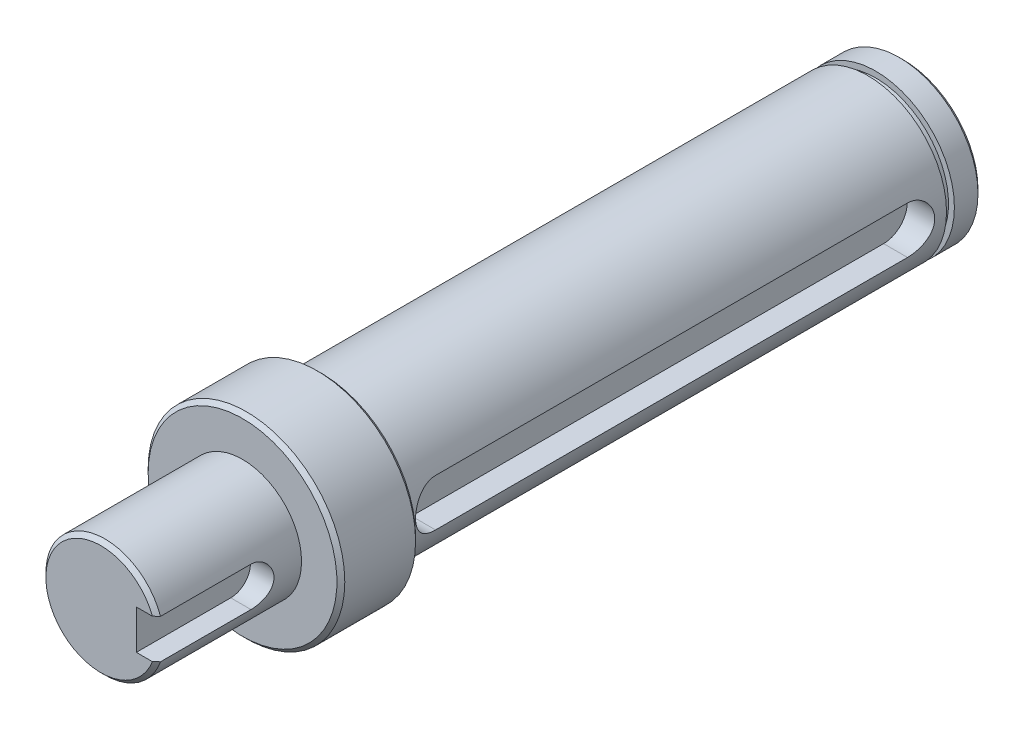
ISO-10303-21;
HEADER;
FILE_DESCRIPTION(('STEP AP214'),'2;1');
FILE_NAME('part.step','',(''),(''),'','','');
FILE_SCHEMA(('AUTOMOTIVE_DESIGN { 1 0 10303 214 1 1 1 1 }'));
ENDSEC;
DATA;
#1=APPLICATION_CONTEXT('core data for automotive mechanical design processes');
#2=APPLICATION_PROTOCOL_DEFINITION('international standard','automotive_design',2000,#1);
#3=PRODUCT_CONTEXT('',#1,'mechanical');
#4=PRODUCT('Part','Part','',(#3));
#5=PRODUCT_RELATED_PRODUCT_CATEGORY('part','',(#4));
#6=PRODUCT_DEFINITION_FORMATION('','',#4);
#7=PRODUCT_DEFINITION_CONTEXT('part definition',#1,'design');
#8=PRODUCT_DEFINITION('design','',#6,#7);
#9=PRODUCT_DEFINITION_SHAPE('','',#8);
#10=(LENGTH_UNIT() NAMED_UNIT(*) SI_UNIT(.MILLI.,.METRE.));
#11=(NAMED_UNIT(*) PLANE_ANGLE_UNIT() SI_UNIT($,.RADIAN.));
#12=(NAMED_UNIT(*) SI_UNIT($,.STERADIAN.) SOLID_ANGLE_UNIT());
#13=UNCERTAINTY_MEASURE_WITH_UNIT(LENGTH_MEASURE(1.E-05),#10,'distance_accuracy_value','');
#14=(GEOMETRIC_REPRESENTATION_CONTEXT(3) GLOBAL_UNCERTAINTY_ASSIGNED_CONTEXT((#13)) GLOBAL_UNIT_ASSIGNED_CONTEXT((#10,
#11,#12)) REPRESENTATION_CONTEXT('',''));
#15=CARTESIAN_POINT('',(0.,0.,0.));
#16=DIRECTION('',(0.,0.,1.));
#17=DIRECTION('',(1.,0.,0.));
#18=AXIS2_PLACEMENT_3D('',#15,#16,#17);
#19=CARTESIAN_POINT('',(0.,0.,102.));
#20=DIRECTION('',(0.,0.,1.));
#21=DIRECTION('',(1.,0.,0.));
#22=AXIS2_PLACEMENT_3D('',#19,#20,#21);
#23=PLANE('',#22);
#24=DIRECTION('',(-1.,0.,0.));
#25=VECTOR('',#24,1.);
#26=CARTESIAN_POINT('',(4.5,-2.5,102.000000000005));
#27=LINE('',#26,#25);
#28=CARTESIAN_POINT('',(6.53834841531369,-2.5,102.000000000005));
#29=VERTEX_POINT('',#28);
#30=CARTESIAN_POINT('',(4.5,-2.5,102.000000000003));
#31=VERTEX_POINT('',#30);
#32=EDGE_CURVE('E33',#29,#31,#27,.T.);
#33=ORIENTED_EDGE('',*,*,#32,.T.);
#34=DIRECTION('',(0.,-1.,0.));
#35=VECTOR('',#34,1.);
#36=CARTESIAN_POINT('',(4.5,0.,102.));
#37=LINE('',#36,#35);
#38=CARTESIAN_POINT('',(4.5,2.5,102.));
#39=VERTEX_POINT('',#38);
#40=EDGE_CURVE('E11',#39,#31,#37,.T.);
#41=ORIENTED_EDGE('',*,*,#40,.F.);
#42=DIRECTION('',(1.,0.,0.));
#43=VECTOR('',#42,1.);
#44=CARTESIAN_POINT('',(4.5,2.5,102.));
#45=LINE('',#44,#43);
#46=CARTESIAN_POINT('',(6.53834841531371,2.5,102.000000000005));
#47=VERTEX_POINT('',#46);
#48=EDGE_CURVE('E204',#39,#47,#45,.T.);
#49=ORIENTED_EDGE('',*,*,#48,.T.);
#50=CARTESIAN_POINT('',(0.,0.,102.000000000009));
#51=DIRECTION('',(0.,0.,-1.));
#52=DIRECTION('',(-1.,0.,0.));
#53=AXIS2_PLACEMENT_3D('',#50,#51,#52);
#54=CIRCLE('',#53,6.99999999999794);
#55=EDGE_CURVE('E191',#29,#47,#54,.T.);
#56=ORIENTED_EDGE('',*,*,#55,.F.);
#57=EDGE_LOOP('',(#33,#41,#49,#56));
#58=FACE_BOUND('',#57,.T.);
#59=ADVANCED_FACE('F17',(#58),#23,.T.);
#60=CARTESIAN_POINT('',(4.5,0.,0.));
#61=DIRECTION('',(1.,0.,0.));
#62=DIRECTION('',(0.,1.,0.));
#63=AXIS2_PLACEMENT_3D('',#60,#61,#62);
#64=PLANE('',#63);
#65=DIRECTION('',(0.,0.,-1.));
#66=VECTOR('',#65,1.);
#67=CARTESIAN_POINT('',(4.5,-2.5,102.));
#68=LINE('',#67,#66);
#69=CARTESIAN_POINT('',(4.5,-2.5,90.));
#70=VERTEX_POINT('',#69);
#71=EDGE_CURVE('E140',#31,#70,#68,.T.);
#72=ORIENTED_EDGE('',*,*,#71,.T.);
#73=CARTESIAN_POINT('',(4.5,0.,90.));
#74=DIRECTION('',(1.,0.,0.));
#75=DIRECTION('',(0.,0.,-1.));
#76=AXIS2_PLACEMENT_3D('',#73,#74,#75);
#77=CIRCLE('',#76,2.5);
#78=CARTESIAN_POINT('',(4.5,2.5,90.));
#79=VERTEX_POINT('',#78);
#80=EDGE_CURVE('E185',#70,#79,#77,.T.);
#81=ORIENTED_EDGE('',*,*,#80,.T.);
#82=DIRECTION('',(0.,0.,1.));
#83=VECTOR('',#82,1.);
#84=CARTESIAN_POINT('',(4.5,2.5,90.));
#85=LINE('',#84,#83);
#86=EDGE_CURVE('E143',#79,#39,#85,.T.);
#87=ORIENTED_EDGE('',*,*,#86,.T.);
#88=ORIENTED_EDGE('',*,*,#40,.T.);
#89=EDGE_LOOP('',(#72,#81,#87,#88));
#90=FACE_BOUND('',#89,.T.);
#91=ADVANCED_FACE('F287',(#90),#64,.T.);
#92=CARTESIAN_POINT('',(4.5,-2.5,102.));
#93=DIRECTION('',(0.,-1.,0.));
#94=DIRECTION('',(0.,0.,-1.));
#95=AXIS2_PLACEMENT_3D('',#92,#93,#94);
#96=PLANE('',#95);
#97=ORIENTED_EDGE('',*,*,#71,.F.);
#98=ORIENTED_EDGE('',*,*,#32,.F.);
#99=CARTESIAN_POINT('',(7.07106781186693,-2.50000000000004,101.500000000003));
#100=CARTESIAN_POINT('',(6.8938690276034,-2.5,101.667064615967));
#101=CARTESIAN_POINT('',(6.7163233931204,-2.5,101.833762512275));
#102=CARTESIAN_POINT('',(6.53834841531369,-2.5,102.000000000005));
#103=B_SPLINE_CURVE_WITH_KNOTS('',3,(#99,#100,#101,#102),.UNSPECIFIED.,.F.,.F.,(4,4),(0.,
0.000730609304256414),.UNSPECIFIED.);
#104=CARTESIAN_POINT('',(7.07106781186693,-2.50000000000004,101.500000000003));
#105=VERTEX_POINT('',#104);
#106=EDGE_CURVE('E195',#105,#29,#103,.T.);
#107=ORIENTED_EDGE('',*,*,#106,.F.);
#108=DIRECTION('',(0.,0.,1.));
#109=VECTOR('',#108,1.);
#110=CARTESIAN_POINT('',(7.07106781186545,-2.50000000000008,102.));
#111=LINE('',#110,#109);
#112=CARTESIAN_POINT('',(7.07106781186546,-2.50000000000004,90.));
#113=VERTEX_POINT('',#112);
#114=EDGE_CURVE('E215',#113,#105,#111,.T.);
#115=ORIENTED_EDGE('',*,*,#114,.F.);
#116=DIRECTION('',(1.,0.,0.));
#117=VECTOR('',#116,1.);
#118=CARTESIAN_POINT('',(4.5,-2.5,90.));
#119=LINE('',#118,#117);
#120=EDGE_CURVE('E211',#70,#113,#119,.T.);
#121=ORIENTED_EDGE('',*,*,#120,.F.);
#122=EDGE_LOOP('',(#97,#98,#107,#115,#121));
#123=FACE_BOUND('',#122,.T.);
#124=ADVANCED_FACE('F292',(#123),#96,.F.);
#125=CARTESIAN_POINT('',(4.5,2.5,90.));
#126=DIRECTION('',(0.,1.,0.));
#127=DIRECTION('',(1.,0.,0.));
#128=AXIS2_PLACEMENT_3D('',#125,#126,#127);
#129=PLANE('',#128);
#130=DIRECTION('',(1.,0.,0.));
#131=VECTOR('',#130,1.);
#132=CARTESIAN_POINT('',(4.5,2.5,90.));
#133=LINE('',#132,#131);
#134=CARTESIAN_POINT('',(7.07106781186545,2.50000000000004,90.));
#135=VERTEX_POINT('',#134);
#136=EDGE_CURVE('E189',#79,#135,#133,.T.);
#137=ORIENTED_EDGE('',*,*,#136,.T.);
#138=DIRECTION('',(0.,0.,-1.));
#139=VECTOR('',#138,1.);
#140=CARTESIAN_POINT('',(7.07106781186542,2.50000000000015,102.));
#141=LINE('',#140,#139);
#142=CARTESIAN_POINT('',(7.07106781186717,2.50000000000008,101.500000000002));
#143=VERTEX_POINT('',#142);
#144=EDGE_CURVE('E184',#143,#135,#141,.T.);
#145=ORIENTED_EDGE('',*,*,#144,.F.);
#146=CARTESIAN_POINT('',(6.53834841531371,2.5,102.000000000005));
#147=CARTESIAN_POINT('',(6.71632339312194,2.5,101.833762512273));
#148=CARTESIAN_POINT('',(6.89386902760443,2.5,101.667064615966));
#149=CARTESIAN_POINT('',(7.07106781186717,2.50000000000008,101.500000000002));
#150=B_SPLINE_CURVE_WITH_KNOTS('',3,(#146,#147,#148,#149),.UNSPECIFIED.,.F.,.F.,(4,4),(0.,
0.000730609304253691),.UNSPECIFIED.);
#151=EDGE_CURVE('E208',#47,#143,#150,.T.);
#152=ORIENTED_EDGE('',*,*,#151,.F.);
#153=ORIENTED_EDGE('',*,*,#48,.F.);
#154=ORIENTED_EDGE('',*,*,#86,.F.);
#155=EDGE_LOOP('',(#137,#145,#152,#153,#154));
#156=FACE_BOUND('',#155,.T.);
#157=ADVANCED_FACE('F675',(#156),#129,.F.);
#158=CARTESIAN_POINT('',(0.,0.,0.));
#159=DIRECTION('',(0.,0.,1.));
#160=DIRECTION('',(1.,0.,0.));
#161=AXIS2_PLACEMENT_3D('',#158,#159,#160);
#162=PLANE('',#161);
#163=CARTESIAN_POINT('',(0.,0.,0.));
#164=DIRECTION('',(0.,0.,1.));
#165=DIRECTION('',(1.,0.,0.));
#166=AXIS2_PLACEMENT_3D('',#163,#164,#165);
#167=CIRCLE('',#166,9.5);
#168=CARTESIAN_POINT('',(9.5,0.,0.));
#169=VERTEX_POINT('',#168);
#170=EDGE_CURVE('E172',#169,#169,#167,.T.);
#171=ORIENTED_EDGE('',*,*,#170,.F.);
#172=EDGE_LOOP('',(#171));
#173=FACE_BOUND('',#172,.T.);
#174=ADVANCED_FACE('F664',(#173),#162,.F.);
#175=CARTESIAN_POINT('',(0.,0.,84.));
#176=DIRECTION('',(0.,0.,1.));
#177=DIRECTION('',(1.,0.,0.));
#178=AXIS2_PLACEMENT_3D('',#175,#176,#177);
#179=PLANE('',#178);
#180=CARTESIAN_POINT('',(0.,0.,84.));
#181=DIRECTION('',(0.,0.,-1.));
#182=DIRECTION('',(1.,0.,0.));
#183=AXIS2_PLACEMENT_3D('',#180,#181,#182);
#184=CIRCLE('',#183,7.5);
#185=CARTESIAN_POINT('',(7.5,0.,84.));
#186=VERTEX_POINT('',#185);
#187=EDGE_CURVE('E176',#186,#186,#184,.T.);
#188=ORIENTED_EDGE('',*,*,#187,.T.);
#189=EDGE_LOOP('',(#188));
#190=FACE_BOUND('',#189,.T.);
#191=CARTESIAN_POINT('',(0.,0.,84.));
#192=DIRECTION('',(0.,0.,-1.));
#193=DIRECTION('',(-1.,0.,0.));
#194=AXIS2_PLACEMENT_3D('',#191,#192,#193);
#195=CIRCLE('',#194,12.);
#196=CARTESIAN_POINT('',(-12.,0.,84.));
#197=VERTEX_POINT('',#196);
#198=EDGE_CURVE('E160',#197,#197,#195,.T.);
#199=ORIENTED_EDGE('',*,*,#198,.F.);
#200=EDGE_LOOP('',(#199));
#201=FACE_BOUND('',#200,.T.);
#202=ADVANCED_FACE('F653',(#190,#201),#179,.T.);
#203=CARTESIAN_POINT('',(0.,0.,3.5));
#204=DIRECTION('',(0.,0.,-1.));
#205=DIRECTION('',(0.,-1.,0.));
#206=AXIS2_PLACEMENT_3D('',#203,#204,#205);
#207=PLANE('',#206);
#208=CARTESIAN_POINT('',(0.,0.,3.5));
#209=DIRECTION('',(0.,0.,1.));
#210=DIRECTION('',(-1.,0.,0.));
#211=AXIS2_PLACEMENT_3D('',#208,#209,#210);
#212=CIRCLE('',#211,9.25);
#213=CARTESIAN_POINT('',(-9.25,0.,3.5));
#214=VERTEX_POINT('',#213);
#215=EDGE_CURVE('E152',#214,#214,#212,.T.);
#216=ORIENTED_EDGE('',*,*,#215,.F.);
#217=EDGE_LOOP('',(#216));
#218=FACE_BOUND('',#217,.T.);
#219=CARTESIAN_POINT('',(0.,0.,3.5));
#220=DIRECTION('',(0.,0.,-1.));
#221=DIRECTION('',(1.,0.,0.));
#222=AXIS2_PLACEMENT_3D('',#219,#220,#221);
#223=CIRCLE('',#222,10.);
#224=CARTESIAN_POINT('',(10.,0.,3.5));
#225=VERTEX_POINT('',#224);
#226=EDGE_CURVE('E168',#225,#225,#223,.T.);
#227=ORIENTED_EDGE('',*,*,#226,.F.);
#228=EDGE_LOOP('',(#227));
#229=FACE_BOUND('',#228,.T.);
#230=ADVANCED_FACE('F643',(#218,#229),#207,.F.);
#231=CARTESIAN_POINT('',(6.5,0.,0.));
#232=DIRECTION('',(1.,0.,0.));
#233=DIRECTION('',(0.,1.,0.));
#234=AXIS2_PLACEMENT_3D('',#231,#232,#233);
#235=PLANE('',#234);
#236=DIRECTION('',(0.,0.,-1.));
#237=VECTOR('',#236,1.);
#238=CARTESIAN_POINT('',(6.5,-3.,69.));
#239=LINE('',#238,#237);
#240=CARTESIAN_POINT('',(6.5,-3.,69.));
#241=VERTEX_POINT('',#240);
#242=CARTESIAN_POINT('',(6.5,-3.,9.));
#243=VERTEX_POINT('',#242);
#244=EDGE_CURVE('E198',#241,#243,#239,.T.);
#245=ORIENTED_EDGE('',*,*,#244,.T.);
#246=CARTESIAN_POINT('',(6.5,0.,9.));
#247=DIRECTION('',(1.,0.,0.));
#248=DIRECTION('',(0.,0.,-1.));
#249=AXIS2_PLACEMENT_3D('',#246,#247,#248);
#250=CIRCLE('',#249,3.);
#251=CARTESIAN_POINT('',(6.5,3.,9.));
#252=VERTEX_POINT('',#251);
#253=EDGE_CURVE('E136',#243,#252,#250,.T.);
#254=ORIENTED_EDGE('',*,*,#253,.T.);
#255=DIRECTION('',(0.,0.,1.));
#256=VECTOR('',#255,1.);
#257=CARTESIAN_POINT('',(6.5,3.,9.));
#258=LINE('',#257,#256);
#259=CARTESIAN_POINT('',(6.5,3.,69.));
#260=VERTEX_POINT('',#259);
#261=EDGE_CURVE('E201',#252,#260,#258,.T.);
#262=ORIENTED_EDGE('',*,*,#261,.T.);
#263=CARTESIAN_POINT('',(6.5,0.,69.));
#264=DIRECTION('',(1.,0.,0.));
#265=DIRECTION('',(0.,0.,-1.));
#266=AXIS2_PLACEMENT_3D('',#263,#264,#265);
#267=CIRCLE('',#266,3.);
#268=EDGE_CURVE('E101',#260,#241,#267,.T.);
#269=ORIENTED_EDGE('',*,*,#268,.T.);
#270=EDGE_LOOP('',(#245,#254,#262,#269));
#271=FACE_BOUND('',#270,.T.);
#272=ADVANCED_FACE('F335',(#271),#235,.T.);
#273=CARTESIAN_POINT('',(6.5,3.,9.));
#274=DIRECTION('',(0.,1.,0.));
#275=DIRECTION('',(1.,0.,0.));
#276=AXIS2_PLACEMENT_3D('',#273,#274,#275);
#277=PLANE('',#276);
#278=DIRECTION('',(1.,0.,0.));
#279=VECTOR('',#278,1.);
#280=CARTESIAN_POINT('',(6.5,3.,9.));
#281=LINE('',#280,#279);
#282=CARTESIAN_POINT('',(9.53939201416945,3.00000000000002,9.));
#283=VERTEX_POINT('',#282);
#284=EDGE_CURVE('E85',#252,#283,#281,.T.);
#285=ORIENTED_EDGE('',*,*,#284,.T.);
#286=DIRECTION('',(0.,0.,-1.));
#287=VECTOR('',#286,1.);
#288=CARTESIAN_POINT('',(9.53939201416944,3.00000000000007,0.));
#289=LINE('',#288,#287);
#290=CARTESIAN_POINT('',(9.53939201416945,3.00000000000003,69.));
#291=VERTEX_POINT('',#290);
#292=EDGE_CURVE('E106',#291,#283,#289,.T.);
#293=ORIENTED_EDGE('',*,*,#292,.F.);
#294=DIRECTION('',(-1.,0.,0.));
#295=VECTOR('',#294,1.);
#296=CARTESIAN_POINT('',(6.5,3.,69.));
#297=LINE('',#296,#295);
#298=EDGE_CURVE('E95',#291,#260,#297,.T.);
#299=ORIENTED_EDGE('',*,*,#298,.T.);
#300=ORIENTED_EDGE('',*,*,#261,.F.);
#301=EDGE_LOOP('',(#285,#293,#299,#300));
#302=FACE_BOUND('',#301,.T.);
#303=ADVANCED_FACE('F107',(#302),#277,.F.);
#304=CARTESIAN_POINT('',(0.,0.,4.5));
#305=DIRECTION('',(0.,0.,-1.));
#306=DIRECTION('',(0.,-1.,0.));
#307=AXIS2_PLACEMENT_3D('',#304,#305,#306);
#308=PLANE('',#307);
#309=CARTESIAN_POINT('',(0.,0.,4.5));
#310=DIRECTION('',(0.,0.,1.));
#311=DIRECTION('',(-1.,0.,0.));
#312=AXIS2_PLACEMENT_3D('',#309,#310,#311);
#313=CIRCLE('',#312,9.25);
#314=CARTESIAN_POINT('',(-9.25,0.,4.5));
#315=VERTEX_POINT('',#314);
#316=EDGE_CURVE('E148',#315,#315,#313,.T.);
#317=ORIENTED_EDGE('',*,*,#316,.T.);
#318=EDGE_LOOP('',(#317));
#319=FACE_BOUND('',#318,.T.);
#320=CARTESIAN_POINT('',(0.,0.,4.5));
#321=DIRECTION('',(0.,0.,1.));
#322=DIRECTION('',(1.,0.,0.));
#323=AXIS2_PLACEMENT_3D('',#320,#321,#322);
#324=CIRCLE('',#323,10.);
#325=CARTESIAN_POINT('',(10.,0.,4.5));
#326=VERTEX_POINT('',#325);
#327=EDGE_CURVE('E123',#326,#326,#324,.T.);
#328=ORIENTED_EDGE('',*,*,#327,.F.);
#329=EDGE_LOOP('',(#328));
#330=FACE_BOUND('',#329,.T.);
#331=ADVANCED_FACE('F283',(#319,#330),#308,.T.);
#332=CARTESIAN_POINT('',(6.5,-3.,69.));
#333=DIRECTION('',(0.,-1.,0.));
#334=DIRECTION('',(0.,0.,-1.));
#335=AXIS2_PLACEMENT_3D('',#332,#333,#334);
#336=PLANE('',#335);
#337=DIRECTION('',(1.,0.,0.));
#338=VECTOR('',#337,1.);
#339=CARTESIAN_POINT('',(6.5,-3.,69.));
#340=LINE('',#339,#338);
#341=CARTESIAN_POINT('',(9.53939201416945,-3.00000000000002,69.));
#342=VERTEX_POINT('',#341);
#343=EDGE_CURVE('E103',#241,#342,#340,.T.);
#344=ORIENTED_EDGE('',*,*,#343,.T.);
#345=DIRECTION('',(0.,0.,1.));
#346=VECTOR('',#345,1.);
#347=CARTESIAN_POINT('',(9.53939201416944,-3.00000000000007,0.));
#348=LINE('',#347,#346);
#349=CARTESIAN_POINT('',(9.53939201416945,-3.00000000000003,9.));
#350=VERTEX_POINT('',#349);
#351=EDGE_CURVE('E115',#350,#342,#348,.T.);
#352=ORIENTED_EDGE('',*,*,#351,.F.);
#353=DIRECTION('',(1.,0.,0.));
#354=VECTOR('',#353,1.);
#355=CARTESIAN_POINT('',(6.5,-3.,9.));
#356=LINE('',#355,#354);
#357=EDGE_CURVE('E202',#243,#350,#356,.T.);
#358=ORIENTED_EDGE('',*,*,#357,.F.);
#359=ORIENTED_EDGE('',*,*,#244,.F.);
#360=EDGE_LOOP('',(#344,#352,#358,#359));
#361=FACE_BOUND('',#360,.T.);
#362=ADVANCED_FACE('F274',(#361),#336,.F.);
#363=CARTESIAN_POINT('',(6.5,0.,69.));
#364=DIRECTION('',(1.,0.,0.));
#365=DIRECTION('',(0.,0.,-1.));
#366=AXIS2_PLACEMENT_3D('',#363,#364,#365);
#367=CYLINDRICAL_SURFACE('',#366,3.);
#368=ORIENTED_EDGE('',*,*,#268,.F.);
#369=ORIENTED_EDGE('',*,*,#298,.F.);
#370=CARTESIAN_POINT('',(9.53939201416946,-3.,69.));
#371=CARTESIAN_POINT('',(9.53938054249417,-3.00001027895934,69.0823355370358));
#372=CARTESIAN_POINT('',(9.54045772107433,-2.9966106257559,69.1646644875045));
#373=CARTESIAN_POINT('',(9.54470412314477,-2.98307142205452,69.3286940176242));
#374=CARTESIAN_POINT('',(9.54787287629741,-2.97293338682998,69.4103947343702));
#375=CARTESIAN_POINT('',(9.55620668851911,-2.94603139056218,69.5723849967112));
#376=CARTESIAN_POINT('',(9.56136667716472,-2.92928425630027,69.6526775893566));
#377=CARTESIAN_POINT('',(9.5735162693636,-2.88932851886642,69.8114758770375));
#378=CARTESIAN_POINT('',(9.58050592072762,-2.866119746845,69.8899815253203));
#379=CARTESIAN_POINT('',(9.60391662385355,-2.78708502416591,70.1219518327815));
#380=CARTESIAN_POINT('',(9.62279067845329,-2.72181653016416,70.27207318701));
#381=CARTESIAN_POINT('',(9.66493287695928,-2.56814755436988,70.5592304056853));
#382=CARTESIAN_POINT('',(9.6882029257212,-2.47973703833558,70.6962605585994));
#383=CARTESIAN_POINT('',(9.73733420302833,-2.27930849550538,70.9577106851315));
#384=CARTESIAN_POINT('',(9.76325026625715,-2.166691120715,71.0816617837632));
#385=CARTESIAN_POINT('',(9.81429160768497,-1.92230070953154,71.309254500985));
#386=CARTESIAN_POINT('',(9.83941660298856,-1.7905209129883,71.4128889218012));
#387=CARTESIAN_POINT('',(9.88667632839967,-1.50815545770214,71.5989716662056));
#388=CARTESIAN_POINT('',(9.90873687030156,-1.35723196683502,71.6809274064478));
#389=CARTESIAN_POINT('',(9.94670462818565,-1.0430686782272,71.8180322185028));
#390=CARTESIAN_POINT('',(9.96261931561447,-0.879844125242255,71.8732138603587));
#391=CARTESIAN_POINT('',(9.98287579804492,-0.596548324862486,71.94253583685));
#392=CARTESIAN_POINT('',(9.98926260707874,-0.478373820330041,71.9640437003384));
#393=CARTESIAN_POINT('',(9.99782637334373,-0.240148336130586,71.9927780957899));
#394=CARTESIAN_POINT('',(10.0000034822475,-0.120097424226379,72.0000051422815));
#395=CARTESIAN_POINT('',(9.99999523060353,0.164489234348372,71.9999929569685));
#396=CARTESIAN_POINT('',(9.99589991015214,0.329065720737739,71.9864191169715));
#397=CARTESIAN_POINT('',(9.97995006967909,0.653490999591235,71.9325826879748));
#398=CARTESIAN_POINT('',(9.96808860795407,0.813335428615343,71.8922962216971));
#399=CARTESIAN_POINT('',(9.93791009433949,1.12347011158705,71.7865050942094));
#400=CARTESIAN_POINT('',(9.91960419421206,1.27377634392766,71.7210439784389));
#401=CARTESIAN_POINT('',(9.87844006363517,1.56126220394395,71.5669193755498));
#402=CARTESIAN_POINT('',(9.85558166074303,1.69844133409119,71.4782550094834));
#403=CARTESIAN_POINT('',(9.80701538948711,1.95973986527062,71.2775549115124));
#404=CARTESIAN_POINT('',(9.78124908785864,2.08342941267904,71.16497372425));
#405=CARTESIAN_POINT('',(9.73011795426101,2.31049322801525,70.9207873835494));
#406=CARTESIAN_POINT('',(9.70475321204041,2.41386301180395,70.7891780420987));
#407=CARTESIAN_POINT('',(9.65667462243887,2.59963060323033,70.5070161609606));
#408=CARTESIAN_POINT('',(9.63403435555661,2.68149682109276,70.3561002868777));
#409=CARTESIAN_POINT('',(9.59486058982744,2.81846673521561,70.0418990807473));
#410=CARTESIAN_POINT('',(9.57832166954832,2.87359420432482,69.8786248861037));
#411=CARTESIAN_POINT('',(9.5572566319582,2.94274437943066,69.5954604259145));
#412=CARTESIAN_POINT('',(9.5506065799203,2.96417022567603,69.4774850132136));
#413=CARTESIAN_POINT('',(9.54165234585049,2.9928130046432,69.2396975071264));
#414=CARTESIAN_POINT('',(9.53934692103299,3.0000340007046,69.1198859488609));
#415=CARTESIAN_POINT('',(9.53939201416946,3.,69.));
#416=B_SPLINE_CURVE_WITH_KNOTS('',3,(#370,#371,#372,#373,#374,#375,#376,#377,#378,#379,#380,
#381,#382,#383,#384,#385,#386,#387,#388,#389,#390,#391,#392,#393,#394,#395,#396,#397,#398,#399,
#400,#401,#402,#403,#404,#405,#406,#407,#408,#409,#410,#411,#412,#413,#414,#415),.UNSPECIFIED.,
.F.,.F.,(4,2,2,2,2,2,2,2,2,2,2,2,2,2,2,2,2,2,2,2,2,2,4),(0.,0.24691819106501,0.493780875921372,
0.740019061165644,0.986263681479818,1.47814125360909,1.9702324552064,2.47630442396385,
2.9825553607039,3.49947665595046,4.01576754248543,4.37574541528924,4.73571031809103,
5.22872964498802,5.72219025599609,6.2148011230278,6.70743065304562,7.21280916075507,
7.71829906984376,8.23530810627166,8.75185663461062,9.11124123623649,9.47052301987161),.UNSPECIFIED.);
#417=EDGE_CURVE('E20',#342,#291,#416,.T.);
#418=ORIENTED_EDGE('',*,*,#417,.F.);
#419=ORIENTED_EDGE('',*,*,#343,.F.);
#420=EDGE_LOOP('',(#368,#369,#418,#419));
#421=FACE_BOUND('',#420,.T.);
#422=ADVANCED_FACE('F96',(#421),#367,.F.);
#423=CARTESIAN_POINT('',(0.,0.,74.));
#424=DIRECTION('',(0.,0.,1.));
#425=DIRECTION('',(1.,0.,0.));
#426=AXIS2_PLACEMENT_3D('',#423,#424,#425);
#427=PLANE('',#426);
#428=CARTESIAN_POINT('',(0.,0.,74.));
#429=DIRECTION('',(0.,0.,-1.));
#430=DIRECTION('',(1.,0.,0.));
#431=AXIS2_PLACEMENT_3D('',#428,#429,#430);
#432=CIRCLE('',#431,10.);
#433=CARTESIAN_POINT('',(10.,0.,74.));
#434=VERTEX_POINT('',#433);
#435=EDGE_CURVE('E117',#434,#434,#432,.T.);
#436=ORIENTED_EDGE('',*,*,#435,.F.);
#437=EDGE_LOOP('',(#436));
#438=FACE_BOUND('',#437,.T.);
#439=CARTESIAN_POINT('',(0.,0.,74.));
#440=DIRECTION('',(0.,0.,1.));
#441=DIRECTION('',(1.,0.,0.));
#442=AXIS2_PLACEMENT_3D('',#439,#440,#441);
#443=CIRCLE('',#442,12.);
#444=CARTESIAN_POINT('',(12.,0.,74.));
#445=VERTEX_POINT('',#444);
#446=EDGE_CURVE('E144',#445,#445,#443,.T.);
#447=ORIENTED_EDGE('',*,*,#446,.F.);
#448=EDGE_LOOP('',(#447));
#449=FACE_BOUND('',#448,.T.);
#450=ADVANCED_FACE('F273',(#438,#449),#427,.F.);
#451=CARTESIAN_POINT('',(0.,0.,101.500000000005));
#452=DIRECTION('',(0.,0.,-1.));
#453=DIRECTION('',(-1.,0.,0.));
#454=AXIS2_PLACEMENT_3D('',#451,#452,#453);
#455=CONICAL_SURFACE('',#454,7.50000000000173,0.785398163397298);
#456=ORIENTED_EDGE('',*,*,#55,.T.);
#457=ORIENTED_EDGE('',*,*,#151,.T.);
#458=CARTESIAN_POINT('',(0.,0.,101.5));
#459=DIRECTION('',(0.,0.,-1.));
#460=DIRECTION('',(1.,0.,0.));
#461=AXIS2_PLACEMENT_3D('',#458,#459,#460);
#462=CIRCLE('',#461,7.5);
#463=EDGE_CURVE('E180',#105,#143,#462,.T.);
#464=ORIENTED_EDGE('',*,*,#463,.F.);
#465=ORIENTED_EDGE('',*,*,#106,.T.);
#466=EDGE_LOOP('',(#456,#457,#464,#465));
#467=FACE_BOUND('',#466,.T.);
#468=ADVANCED_FACE('F280',(#467),#455,.T.);
#469=CARTESIAN_POINT('',(4.5,0.,90.));
#470=DIRECTION('',(1.,0.,0.));
#471=DIRECTION('',(0.,0.,-1.));
#472=AXIS2_PLACEMENT_3D('',#469,#470,#471);
#473=CYLINDRICAL_SURFACE('',#472,2.5);
#474=ORIENTED_EDGE('',*,*,#80,.F.);
#475=ORIENTED_EDGE('',*,*,#120,.T.);
#476=CARTESIAN_POINT('',(7.07106781186548,2.5,90.));
#477=CARTESIAN_POINT('',(7.07105693270503,2.50000899154282,89.9317928600661));
#478=CARTESIAN_POINT('',(7.07205444084989,2.49720886733229,89.8635918010514));
#479=CARTESIAN_POINT('',(7.07598525013897,2.48606043221645,89.7277187143714));
#480=CARTESIAN_POINT('',(7.07891802873099,2.47771361899647,89.6600465488864));
#481=CARTESIAN_POINT('',(7.08662707354274,2.45557453400979,89.525909206494));
#482=CARTESIAN_POINT('',(7.09139786765818,2.44179842347305,89.4594410542887));
#483=CARTESIAN_POINT('',(7.10262621094713,2.40894177361976,89.3279916111835));
#484=CARTESIAN_POINT('',(7.10908382104694,2.38986104270343,89.2630103740818));
#485=CARTESIAN_POINT('',(7.13069961659174,2.32491489772689,89.0710365713998));
#486=CARTESIAN_POINT('',(7.14811294473447,2.27131267419218,88.9468172523157));
#487=CARTESIAN_POINT('',(7.18697096197061,2.14517567710436,88.7091198875395));
#488=CARTESIAN_POINT('',(7.20841800828456,2.07262982361339,88.595648181123));
#489=CARTESIAN_POINT('',(7.25385980717432,1.90763752637635,88.3782167862427));
#490=CARTESIAN_POINT('',(7.27791769723887,1.81458001304931,88.2747330564494));
#491=CARTESIAN_POINT('',(7.32534216318208,1.61248891950258,88.0844979949421));
#492=CARTESIAN_POINT('',(7.34870849247481,1.5034497213413,87.9977525720821));
#493=CARTESIAN_POINT('',(7.39285747289025,1.26895751987032,87.841265392235));
#494=CARTESIAN_POINT('',(7.41355529841144,1.14314626508755,87.772034861832));
#495=CARTESIAN_POINT('',(7.44925407956136,0.88093317999036,87.6559740503655));
#496=CARTESIAN_POINT('',(7.46426202166911,0.744544586971225,87.60911627983));
#497=CARTESIAN_POINT('',(7.48354846367353,0.506300675166026,87.549690597762));
#498=CARTESIAN_POINT('',(7.48968322019214,0.406058263108662,87.5310951056451));
#499=CARTESIAN_POINT('',(7.49791042792564,0.203889799850683,87.5062480091046));
#500=CARTESIAN_POINT('',(7.50000310351818,0.101963842421192,87.4999957195041));
#501=CARTESIAN_POINT('',(7.49999585089056,-0.136315986093231,87.5000057226171));
#502=CARTESIAN_POINT('',(7.4962458835407,-0.272699684614852,87.5111939092018));
#503=CARTESIAN_POINT('',(7.48163956328172,-0.541516270785041,87.5555462732939));
#504=CARTESIAN_POINT('',(7.47077716655328,-0.673945698112932,87.5887291411775));
#505=CARTESIAN_POINT('',(7.44313156015457,-0.930836693603671,87.6758011305991));
#506=CARTESIAN_POINT('',(7.42636012127297,-1.05531352518435,87.7296491062153));
#507=CARTESIAN_POINT('',(7.38860874187809,-1.29345159463983,87.8563614948809));
#508=CARTESIAN_POINT('',(7.36762846783368,-1.40711197430664,87.929227415154));
#509=CARTESIAN_POINT('',(7.32285301732708,-1.62435071466864,88.0945618758996));
#510=CARTESIAN_POINT('',(7.29899036528703,-1.72750303379408,88.1875718243772));
#511=CARTESIAN_POINT('',(7.2515091780067,-1.91707692379428,88.3894124093757));
#512=CARTESIAN_POINT('',(7.22789071244763,-2.0034938373395,88.4982474351778));
#513=CARTESIAN_POINT('',(7.18282551254983,-2.1595896893092,88.7325014535183));
#514=CARTESIAN_POINT('',(7.16146193023259,-2.228708654529,88.8583107447582));
#515=CARTESIAN_POINT('',(7.12437037484979,-2.34458286296321,89.1205497817602));
#516=CARTESIAN_POINT('',(7.10863672324039,-2.39136065629644,89.2569686562465));
#517=CARTESIAN_POINT('',(7.08840130832343,-2.4505618689317,89.4949965732501));
#518=CARTESIAN_POINT('',(7.08195398108628,-2.46905377096011,89.5949701156808));
#519=CARTESIAN_POINT('',(7.0732634262911,-2.49379018454877,89.7966057881893));
#520=CARTESIAN_POINT('',(7.0710205823415,-2.50003357858267,89.8982680714907));
#521=CARTESIAN_POINT('',(7.07106781186547,-2.5,90.));
#522=B_SPLINE_CURVE_WITH_KNOTS('',3,(#476,#477,#478,#479,#480,#481,#482,#483,#484,#485,#486,
#487,#488,#489,#490,#491,#492,#493,#494,#495,#496,#497,#498,#499,#500,#501,#502,#503,#504,#505,
#506,#507,#508,#509,#510,#511,#512,#513,#514,#515,#516,#517,#518,#519,#520,#521),.UNSPECIFIED.,
.F.,.F.,(4,2,2,2,2,2,2,2,2,2,2,2,2,2,2,2,2,2,2,2,2,2,4),(0.,0.204546398102036,0.409037588182144,
0.612924617870064,0.81681901279512,1.22401605540315,1.63145179899783,2.0532418422286,
2.47518051186475,2.90829493949191,3.34087581993438,3.64649798955797,3.95210319347603,
4.36066836460039,4.76958116719543,5.17768398001938,5.58581914592928,6.00670810859367,
6.42771403350074,6.86096580386368,7.29377934138965,7.59860513190245,7.90345873274272),.UNSPECIFIED.);
#523=EDGE_CURVE('E190',#135,#113,#522,.T.);
#524=ORIENTED_EDGE('',*,*,#523,.F.);
#525=ORIENTED_EDGE('',*,*,#136,.F.);
#526=EDGE_LOOP('',(#474,#475,#524,#525));
#527=FACE_BOUND('',#526,.T.);
#528=ADVANCED_FACE('F261',(#527),#473,.F.);
#529=CARTESIAN_POINT('',(0.,0.,102.));
#530=DIRECTION('',(0.,0.,1.));
#531=DIRECTION('',(1.,0.,0.));
#532=AXIS2_PLACEMENT_3D('',#529,#530,#531);
#533=CYLINDRICAL_SURFACE('',#532,7.5);
#534=ORIENTED_EDGE('',*,*,#114,.T.);
#535=ORIENTED_EDGE('',*,*,#463,.T.);
#536=ORIENTED_EDGE('',*,*,#144,.T.);
#537=ORIENTED_EDGE('',*,*,#523,.T.);
#538=EDGE_LOOP('',(#534,#535,#536,#537));
#539=FACE_BOUND('',#538,.T.);
#540=ORIENTED_EDGE('',*,*,#187,.F.);
#541=EDGE_LOOP('',(#540));
#542=FACE_BOUND('',#541,.T.);
#543=ADVANCED_FACE('F264',(#539,#542),#533,.T.);
#544=CARTESIAN_POINT('',(0.,0.,0.5));
#545=DIRECTION('',(0.,0.,1.));
#546=DIRECTION('',(1.,0.,0.));
#547=AXIS2_PLACEMENT_3D('',#544,#545,#546);
#548=CONICAL_SURFACE('',#547,9.99999999999973,0.7853981633973);
#549=CARTESIAN_POINT('',(0.,0.,0.5));
#550=DIRECTION('',(0.,0.,1.));
#551=DIRECTION('',(1.,0.,0.));
#552=AXIS2_PLACEMENT_3D('',#549,#550,#551);
#553=CIRCLE('',#552,10.);
#554=CARTESIAN_POINT('',(10.,0.,0.5));
#555=VERTEX_POINT('',#554);
#556=EDGE_CURVE('E164',#555,#555,#553,.T.);
#557=ORIENTED_EDGE('',*,*,#556,.F.);
#558=EDGE_LOOP('',(#557));
#559=FACE_BOUND('',#558,.T.);
#560=ORIENTED_EDGE('',*,*,#170,.T.);
#561=EDGE_LOOP('',(#560));
#562=FACE_BOUND('',#561,.T.);
#563=ADVANCED_FACE('F268',(#559,#562),#548,.T.);
#564=CARTESIAN_POINT('',(0.,0.,0.));
#565=DIRECTION('',(0.,0.,1.));
#566=DIRECTION('',(1.,0.,0.));
#567=AXIS2_PLACEMENT_3D('',#564,#565,#566);
#568=CYLINDRICAL_SURFACE('',#567,10.);
#569=ORIENTED_EDGE('',*,*,#226,.T.);
#570=EDGE_LOOP('',(#569));
#571=FACE_BOUND('',#570,.T.);
#572=ORIENTED_EDGE('',*,*,#556,.T.);
#573=EDGE_LOOP('',(#572));
#574=FACE_BOUND('',#573,.T.);
#575=ADVANCED_FACE('F550',(#571,#574),#568,.T.);
#576=CARTESIAN_POINT('',(0.,0.,83.5));
#577=DIRECTION('',(0.,0.,-1.));
#578=DIRECTION('',(-1.,0.,0.));
#579=AXIS2_PLACEMENT_3D('',#576,#577,#578);
#580=CONICAL_SURFACE('',#579,12.5,0.785398163397299);
#581=CARTESIAN_POINT('',(0.,0.,83.5));
#582=DIRECTION('',(0.,0.,-1.));
#583=DIRECTION('',(1.,0.,0.));
#584=AXIS2_PLACEMENT_3D('',#581,#582,#583);
#585=CIRCLE('',#584,12.5);
#586=CARTESIAN_POINT('',(12.5,0.,83.5));
#587=VERTEX_POINT('',#586);
#588=EDGE_CURVE('E156',#587,#587,#585,.T.);
#589=ORIENTED_EDGE('',*,*,#588,.F.);
#590=EDGE_LOOP('',(#589));
#591=FACE_BOUND('',#590,.T.);
#592=ORIENTED_EDGE('',*,*,#198,.T.);
#593=EDGE_LOOP('',(#592));
#594=FACE_BOUND('',#593,.T.);
#595=ADVANCED_FACE('F539',(#591,#594),#580,.T.);
#596=CARTESIAN_POINT('',(0.,0.,84.));
#597=DIRECTION('',(0.,0.,1.));
#598=DIRECTION('',(1.,0.,0.));
#599=AXIS2_PLACEMENT_3D('',#596,#597,#598);
#600=CYLINDRICAL_SURFACE('',#599,12.5);
#601=ORIENTED_EDGE('',*,*,#588,.T.);
#602=EDGE_LOOP('',(#601));
#603=FACE_BOUND('',#602,.T.);
#604=CARTESIAN_POINT('',(0.,0.,74.5));
#605=DIRECTION('',(0.,0.,-1.));
#606=DIRECTION('',(1.,0.,0.));
#607=AXIS2_PLACEMENT_3D('',#604,#605,#606);
#608=CIRCLE('',#607,12.5);
#609=CARTESIAN_POINT('',(12.5,0.,74.5));
#610=VERTEX_POINT('',#609);
#611=EDGE_CURVE('E134',#610,#610,#608,.T.);
#612=ORIENTED_EDGE('',*,*,#611,.F.);
#613=EDGE_LOOP('',(#612));
#614=FACE_BOUND('',#613,.T.);
#615=ADVANCED_FACE('F528',(#603,#614),#600,.T.);
#616=CARTESIAN_POINT('',(0.,0.,4.5));
#617=DIRECTION('',(0.,0.,-1.));
#618=DIRECTION('',(-1.,0.,0.));
#619=AXIS2_PLACEMENT_3D('',#616,#617,#618);
#620=CYLINDRICAL_SURFACE('',#619,9.25);
#621=ORIENTED_EDGE('',*,*,#215,.T.);
#622=EDGE_LOOP('',(#621));
#623=FACE_BOUND('',#622,.T.);
#624=ORIENTED_EDGE('',*,*,#316,.F.);
#625=EDGE_LOOP('',(#624));
#626=FACE_BOUND('',#625,.T.);
#627=ADVANCED_FACE('F517',(#623,#626),#620,.T.);
#628=CARTESIAN_POINT('',(0.,0.,74.5));
#629=DIRECTION('',(0.,0.,1.));
#630=DIRECTION('',(1.,0.,0.));
#631=AXIS2_PLACEMENT_3D('',#628,#629,#630);
#632=CONICAL_SURFACE('',#631,12.5,0.785398163397299);
#633=ORIENTED_EDGE('',*,*,#611,.T.);
#634=EDGE_LOOP('',(#633));
#635=FACE_BOUND('',#634,.T.);
#636=ORIENTED_EDGE('',*,*,#446,.T.);
#637=EDGE_LOOP('',(#636));
#638=FACE_BOUND('',#637,.T.);
#639=ADVANCED_FACE('F508',(#635,#638),#632,.T.);
#640=CARTESIAN_POINT('',(6.5,0.,9.));
#641=DIRECTION('',(1.,0.,0.));
#642=DIRECTION('',(0.,0.,-1.));
#643=AXIS2_PLACEMENT_3D('',#640,#641,#642);
#644=CYLINDRICAL_SURFACE('',#643,3.);
#645=ORIENTED_EDGE('',*,*,#253,.F.);
#646=ORIENTED_EDGE('',*,*,#357,.T.);
#647=CARTESIAN_POINT('',(9.53939201416946,3.,9.));
#648=CARTESIAN_POINT('',(9.53938054249417,3.00001027895934,8.9176644629642));
#649=CARTESIAN_POINT('',(9.54045772107433,2.9966106257559,8.83533551249554));
#650=CARTESIAN_POINT('',(9.54470412314477,2.98307142205452,8.67130598237577));
#651=CARTESIAN_POINT('',(9.54787287629741,2.97293338682998,8.58960526562981));
#652=CARTESIAN_POINT('',(9.55620668851911,2.94603139056218,8.42761500328881));
#653=CARTESIAN_POINT('',(9.56136667716472,2.92928425630027,8.34732241064343));
#654=CARTESIAN_POINT('',(9.5735162693636,2.88932851886642,8.18852412296252));
#655=CARTESIAN_POINT('',(9.58050592072762,2.866119746845,8.11001847467974));
#656=CARTESIAN_POINT('',(9.60391662385355,2.78708502416592,7.87804816721847));
#657=CARTESIAN_POINT('',(9.6227906784533,2.72181653016416,7.72792681298999));
#658=CARTESIAN_POINT('',(9.66493287695929,2.56814755436988,7.44076959431473));
#659=CARTESIAN_POINT('',(9.6882029257212,2.47973703833557,7.30373944140064));
#660=CARTESIAN_POINT('',(9.73733420302833,2.27930849550538,7.04228931486854));
#661=CARTESIAN_POINT('',(9.76325026625715,2.166691120715,6.91833821623681));
#662=CARTESIAN_POINT('',(9.81429160768497,1.92230070953154,6.690745499015));
#663=CARTESIAN_POINT('',(9.83941660298856,1.79052091298829,6.5871110781988));
#664=CARTESIAN_POINT('',(9.88667632839967,1.50815545770213,6.40102833379436));
#665=CARTESIAN_POINT('',(9.90873687030155,1.35723196683502,6.31907259355222));
#666=CARTESIAN_POINT('',(9.94670462818564,1.0430686782272,6.18196778149717));
#667=CARTESIAN_POINT('',(9.96261931561447,0.879844125242259,6.12678613964134));
#668=CARTESIAN_POINT('',(9.98287579804492,0.596548324862491,6.05746416314998));
#669=CARTESIAN_POINT('',(9.98926260707874,0.478373820330046,6.03595629966164));
#670=CARTESIAN_POINT('',(9.99782637334373,0.240148336130589,6.00722190421013));
#671=CARTESIAN_POINT('',(10.0000034822475,0.120097424226381,5.99999485771853));
#672=CARTESIAN_POINT('',(9.99999523060353,-0.164489234348372,6.0000070430315));
#673=CARTESIAN_POINT('',(9.99589991015214,-0.329065720737739,6.0135808830285));
#674=CARTESIAN_POINT('',(9.97995006967909,-0.653490999591235,6.06741731202524));
#675=CARTESIAN_POINT('',(9.96808860795407,-0.813335428615342,6.10770377830296));
#676=CARTESIAN_POINT('',(9.93791009433949,-1.12347011158705,6.21349490579055));
#677=CARTESIAN_POINT('',(9.91960419421206,-1.27377634392767,6.27895602156108));
#678=CARTESIAN_POINT('',(9.87844006363517,-1.56126220394396,6.43308062445022));
#679=CARTESIAN_POINT('',(9.85558166074304,-1.69844133409119,6.52174499051665));
#680=CARTESIAN_POINT('',(9.80701538948711,-1.95973986527062,6.72244508848757));
#681=CARTESIAN_POINT('',(9.78124908785864,-2.08342941267904,6.83502627574996));
#682=CARTESIAN_POINT('',(9.73011795426101,-2.31049322801525,7.07921261645062));
#683=CARTESIAN_POINT('',(9.70475321204041,-2.41386301180395,7.21082195790135));
#684=CARTESIAN_POINT('',(9.65667462243888,-2.59963060323033,7.49298383903945));
#685=CARTESIAN_POINT('',(9.63403435555661,-2.68149682109276,7.64389971312232));
#686=CARTESIAN_POINT('',(9.59486058982745,-2.81846673521561,7.95810091925265));
#687=CARTESIAN_POINT('',(9.57832166954832,-2.87359420432483,8.12137511389635));
#688=CARTESIAN_POINT('',(9.5572566319582,-2.94274437943066,8.40453957408549));
#689=CARTESIAN_POINT('',(9.5506065799203,-2.96417022567603,8.52251498678641));
#690=CARTESIAN_POINT('',(9.54165234585049,-2.9928130046432,8.76030249287357));
#691=CARTESIAN_POINT('',(9.53934692103299,-3.0000340007046,8.88011405113909));
#692=CARTESIAN_POINT('',(9.53939201416946,-3.,9.));
#693=B_SPLINE_CURVE_WITH_KNOTS('',3,(#647,#648,#649,#650,#651,#652,#653,#654,#655,#656,#657,
#658,#659,#660,#661,#662,#663,#664,#665,#666,#667,#668,#669,#670,#671,#672,#673,#674,#675,#676,
#677,#678,#679,#680,#681,#682,#683,#684,#685,#686,#687,#688,#689,#690,#691,#692),.UNSPECIFIED.,
.F.,.F.,(4,2,2,2,2,2,2,2,2,2,2,2,2,2,2,2,2,2,2,2,2,2,4),(0.,0.24691819106501,0.493780875921372,
0.740019061165635,0.986263681479816,1.47814125360909,1.97023245520641,2.47630442396385,
2.9825553607039,3.49947665595046,4.01576754248542,4.37574541528924,4.73571031809103,
5.22872964498802,5.72219025599609,6.21480112302779,6.70743065304562,7.21280916075507,
7.71829906984376,8.23530810627165,8.75185663461062,9.11124123623649,9.47052301987161),.UNSPECIFIED.);
#694=EDGE_CURVE('E110',#283,#350,#693,.T.);
#695=ORIENTED_EDGE('',*,*,#694,.F.);
#696=ORIENTED_EDGE('',*,*,#284,.F.);
#697=EDGE_LOOP('',(#645,#646,#695,#696));
#698=FACE_BOUND('',#697,.T.);
#699=ADVANCED_FACE('F332',(#698),#644,.F.);
#700=CARTESIAN_POINT('',(0.,0.,0.));
#701=DIRECTION('',(0.,0.,1.));
#702=DIRECTION('',(1.,0.,0.));
#703=AXIS2_PLACEMENT_3D('',#700,#701,#702);
#704=CYLINDRICAL_SURFACE('',#703,10.);
#705=ORIENTED_EDGE('',*,*,#435,.T.);
#706=EDGE_LOOP('',(#705));
#707=FACE_BOUND('',#706,.T.);
#708=ORIENTED_EDGE('',*,*,#327,.T.);
#709=EDGE_LOOP('',(#708));
#710=FACE_BOUND('',#709,.T.);
#711=ORIENTED_EDGE('',*,*,#351,.T.);
#712=ORIENTED_EDGE('',*,*,#417,.T.);
#713=ORIENTED_EDGE('',*,*,#292,.T.);
#714=ORIENTED_EDGE('',*,*,#694,.T.);
#715=EDGE_LOOP('',(#711,#712,#713,#714));
#716=FACE_BOUND('',#715,.T.);
#717=ADVANCED_FACE('F113',(#707,#710,#716),#704,.T.);
#718=CLOSED_SHELL('',(#59,#91,#124,#157,#174,#202,#230,#272,#303,#331,#362,#422,#450,#468,#528,
#543,#563,#575,#595,#615,#627,#639,#699,#717));
#719=MANIFOLD_SOLID_BREP('B1',#718);
#720=ADVANCED_BREP_SHAPE_REPRESENTATION('',(#18,#719),#14);
#721=SHAPE_DEFINITION_REPRESENTATION(#9,#720);
ENDSEC;
END-ISO-10303-21;
